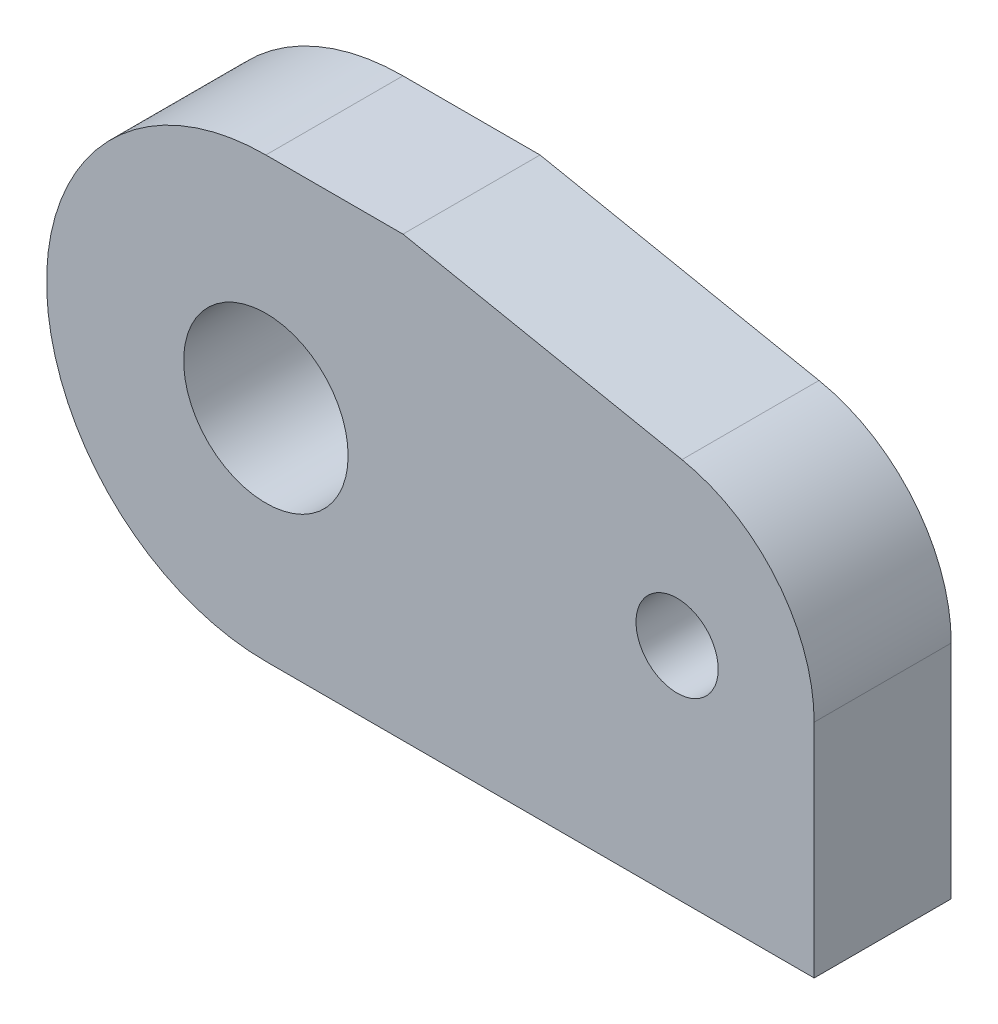
ISO-10303-21;
HEADER;
FILE_DESCRIPTION(('STEP AP214'),'2;1');
FILE_NAME('part.step','',(''),(''),'','','');
FILE_SCHEMA(('AUTOMOTIVE_DESIGN { 1 0 10303 214 1 1 1 1 }'));
ENDSEC;
DATA;
#1=APPLICATION_CONTEXT('core data for automotive mechanical design processes');
#2=APPLICATION_PROTOCOL_DEFINITION('international standard','automotive_design',2000,#1);
#3=PRODUCT_CONTEXT('',#1,'mechanical');
#4=PRODUCT('Part','Part','',(#3));
#5=PRODUCT_RELATED_PRODUCT_CATEGORY('part','',(#4));
#6=PRODUCT_DEFINITION_FORMATION('','',#4);
#7=PRODUCT_DEFINITION_CONTEXT('part definition',#1,'design');
#8=PRODUCT_DEFINITION('design','',#6,#7);
#9=PRODUCT_DEFINITION_SHAPE('','',#8);
#10=(LENGTH_UNIT() NAMED_UNIT(*) SI_UNIT(.MILLI.,.METRE.));
#11=(NAMED_UNIT(*) PLANE_ANGLE_UNIT() SI_UNIT($,.RADIAN.));
#12=(NAMED_UNIT(*) SI_UNIT($,.STERADIAN.) SOLID_ANGLE_UNIT());
#13=UNCERTAINTY_MEASURE_WITH_UNIT(LENGTH_MEASURE(1.E-05),#10,'distance_accuracy_value','');
#14=(GEOMETRIC_REPRESENTATION_CONTEXT(3) GLOBAL_UNCERTAINTY_ASSIGNED_CONTEXT((#13)) GLOBAL_UNIT_ASSIGNED_CONTEXT((#10,
#11,#12)) REPRESENTATION_CONTEXT('',''));
#15=CARTESIAN_POINT('',(0.,0.,0.));
#16=DIRECTION('',(0.,0.,1.));
#17=DIRECTION('',(1.,0.,0.));
#18=AXIS2_PLACEMENT_3D('',#15,#16,#17);
#19=CARTESIAN_POINT('',(0.,0.,5.));
#20=DIRECTION('',(0.,0.,1.));
#21=DIRECTION('',(1.,0.,0.));
#22=AXIS2_PLACEMENT_3D('',#19,#20,#21);
#23=PLANE('',#22);
#24=CARTESIAN_POINT('',(0.,0.,5.));
#25=DIRECTION('',(0.,0.,1.));
#26=DIRECTION('',(1.,0.,0.));
#27=AXIS2_PLACEMENT_3D('',#24,#25,#26);
#28=CIRCLE('',#27,3.);
#29=CARTESIAN_POINT('',(3.,0.,5.));
#30=VERTEX_POINT('',#29);
#31=EDGE_CURVE('E132',#30,#30,#28,.T.);
#32=ORIENTED_EDGE('',*,*,#31,.F.);
#33=EDGE_LOOP('',(#32));
#34=FACE_BOUND('',#33,.T.);
#35=DIRECTION('',(0.,1.,0.));
#36=VECTOR('',#35,1.);
#37=CARTESIAN_POINT('',(20.,-8.,5.));
#38=LINE('',#37,#36);
#39=CARTESIAN_POINT('',(20.,-8.,5.));
#40=VERTEX_POINT('',#39);
#41=CARTESIAN_POINT('',(20.,0.0811765836886535,5.));
#42=VERTEX_POINT('',#41);
#43=EDGE_CURVE('E97',#40,#42,#38,.T.);
#44=ORIENTED_EDGE('',*,*,#43,.T.);
#45=CARTESIAN_POINT('',(14.,0.0811765836886565,5.));
#46=DIRECTION('',(0.,0.,1.));
#47=DIRECTION('',(1.,0.,0.));
#48=AXIS2_PLACEMENT_3D('',#45,#46,#47);
#49=CIRCLE('',#48,6.);
#50=CARTESIAN_POINT('',(15.1766968108291,5.96466063783418,5.));
#51=VERTEX_POINT('',#50);
#52=EDGE_CURVE('E11',#42,#51,#49,.T.);
#53=ORIENTED_EDGE('',*,*,#52,.T.);
#54=DIRECTION('',(-0.98058067569092,0.196116135138184,0.));
#55=VECTOR('',#54,1.);
#56=CARTESIAN_POINT('',(20.,5.,5.));
#57=LINE('',#56,#55);
#58=CARTESIAN_POINT('',(5.,8.,5.));
#59=VERTEX_POINT('',#58);
#60=EDGE_CURVE('E134',#51,#59,#57,.T.);
#61=ORIENTED_EDGE('',*,*,#60,.T.);
#62=DIRECTION('',(-1.,0.,0.));
#63=VECTOR('',#62,1.);
#64=CARTESIAN_POINT('',(0.,8.,5.));
#65=LINE('',#64,#63);
#66=CARTESIAN_POINT('',(0.,8.,5.));
#67=VERTEX_POINT('',#66);
#68=EDGE_CURVE('E103',#59,#67,#65,.T.);
#69=ORIENTED_EDGE('',*,*,#68,.T.);
#70=CARTESIAN_POINT('',(0.,0.,5.));
#71=DIRECTION('',(0.,0.,1.));
#72=DIRECTION('',(1.,0.,0.));
#73=AXIS2_PLACEMENT_3D('',#70,#71,#72);
#74=CIRCLE('',#73,8.);
#75=CARTESIAN_POINT('',(0.,-8.,5.));
#76=VERTEX_POINT('',#75);
#77=EDGE_CURVE('E98',#67,#76,#74,.T.);
#78=ORIENTED_EDGE('',*,*,#77,.T.);
#79=DIRECTION('',(1.,0.,0.));
#80=VECTOR('',#79,1.);
#81=CARTESIAN_POINT('',(0.,-8.,5.));
#82=LINE('',#81,#80);
#83=EDGE_CURVE('E88',#76,#40,#82,.T.);
#84=ORIENTED_EDGE('',*,*,#83,.T.);
#85=EDGE_LOOP('',(#44,#53,#61,#69,#78,#84));
#86=FACE_BOUND('',#85,.T.);
#87=CARTESIAN_POINT('',(15.,0.,5.));
#88=DIRECTION('',(0.,0.,1.));
#89=DIRECTION('',(1.,0.,0.));
#90=AXIS2_PLACEMENT_3D('',#87,#88,#89);
#91=CIRCLE('',#90,1.5);
#92=CARTESIAN_POINT('',(16.5,0.,5.));
#93=VERTEX_POINT('',#92);
#94=EDGE_CURVE('E140',#93,#93,#91,.T.);
#95=ORIENTED_EDGE('',*,*,#94,.F.);
#96=EDGE_LOOP('',(#95));
#97=FACE_BOUND('',#96,.T.);
#98=ADVANCED_FACE('F35',(#34,#86,#97),#23,.T.);
#99=CARTESIAN_POINT('',(0.,0.,0.));
#100=DIRECTION('',(0.,0.,1.));
#101=DIRECTION('',(1.,0.,0.));
#102=AXIS2_PLACEMENT_3D('',#99,#100,#101);
#103=PLANE('',#102);
#104=CARTESIAN_POINT('',(0.,0.,0.));
#105=DIRECTION('',(0.,0.,1.));
#106=DIRECTION('',(1.,0.,0.));
#107=AXIS2_PLACEMENT_3D('',#104,#105,#106);
#108=CIRCLE('',#107,3.);
#109=CARTESIAN_POINT('',(3.,0.,0.));
#110=VERTEX_POINT('',#109);
#111=EDGE_CURVE('E137',#110,#110,#108,.T.);
#112=ORIENTED_EDGE('',*,*,#111,.T.);
#113=EDGE_LOOP('',(#112));
#114=FACE_BOUND('',#113,.T.);
#115=DIRECTION('',(-0.98058067569092,0.196116135138184,0.));
#116=VECTOR('',#115,1.);
#117=CARTESIAN_POINT('',(20.,5.,0.));
#118=LINE('',#117,#116);
#119=CARTESIAN_POINT('',(15.1766968108291,5.96466063783418,0.));
#120=VERTEX_POINT('',#119);
#121=CARTESIAN_POINT('',(5.,8.,0.));
#122=VERTEX_POINT('',#121);
#123=EDGE_CURVE('E125',#120,#122,#118,.T.);
#124=ORIENTED_EDGE('',*,*,#123,.F.);
#125=CARTESIAN_POINT('',(14.,0.0811765836886565,0.));
#126=DIRECTION('',(0.,0.,1.));
#127=DIRECTION('',(1.,0.,0.));
#128=AXIS2_PLACEMENT_3D('',#125,#126,#127);
#129=CIRCLE('',#128,6.);
#130=CARTESIAN_POINT('',(20.,0.0811765836886535,0.));
#131=VERTEX_POINT('',#130);
#132=EDGE_CURVE('E57',#120,#131,#129,.F.);
#133=ORIENTED_EDGE('',*,*,#132,.T.);
#134=DIRECTION('',(0.,1.,0.));
#135=VECTOR('',#134,1.);
#136=CARTESIAN_POINT('',(20.,-8.,0.));
#137=LINE('',#136,#135);
#138=CARTESIAN_POINT('',(20.,-8.,0.));
#139=VERTEX_POINT('',#138);
#140=EDGE_CURVE('E127',#139,#131,#137,.T.);
#141=ORIENTED_EDGE('',*,*,#140,.F.);
#142=DIRECTION('',(1.,0.,0.));
#143=VECTOR('',#142,1.);
#144=CARTESIAN_POINT('',(0.,-8.,0.));
#145=LINE('',#144,#143);
#146=CARTESIAN_POINT('',(0.,-8.,0.));
#147=VERTEX_POINT('',#146);
#148=EDGE_CURVE('E129',#147,#139,#145,.T.);
#149=ORIENTED_EDGE('',*,*,#148,.F.);
#150=CARTESIAN_POINT('',(0.,0.,0.));
#151=DIRECTION('',(0.,0.,1.));
#152=DIRECTION('',(1.,0.,0.));
#153=AXIS2_PLACEMENT_3D('',#150,#151,#152);
#154=CIRCLE('',#153,8.);
#155=CARTESIAN_POINT('',(0.,8.,0.));
#156=VERTEX_POINT('',#155);
#157=EDGE_CURVE('E111',#156,#147,#154,.T.);
#158=ORIENTED_EDGE('',*,*,#157,.F.);
#159=DIRECTION('',(-1.,0.,0.));
#160=VECTOR('',#159,1.);
#161=CARTESIAN_POINT('',(0.,8.,0.));
#162=LINE('',#161,#160);
#163=EDGE_CURVE('E107',#122,#156,#162,.T.);
#164=ORIENTED_EDGE('',*,*,#163,.F.);
#165=EDGE_LOOP('',(#124,#133,#141,#149,#158,#164));
#166=FACE_BOUND('',#165,.T.);
#167=CARTESIAN_POINT('',(15.,0.,0.));
#168=DIRECTION('',(0.,0.,1.));
#169=DIRECTION('',(1.,0.,0.));
#170=AXIS2_PLACEMENT_3D('',#167,#168,#169);
#171=CIRCLE('',#170,1.5);
#172=CARTESIAN_POINT('',(16.5,0.,0.));
#173=VERTEX_POINT('',#172);
#174=EDGE_CURVE('E143',#173,#173,#171,.T.);
#175=ORIENTED_EDGE('',*,*,#174,.T.);
#176=EDGE_LOOP('',(#175));
#177=FACE_BOUND('',#176,.T.);
#178=ADVANCED_FACE('F152',(#114,#166,#177),#103,.F.);
#179=CARTESIAN_POINT('',(0.,0.,5.));
#180=DIRECTION('',(0.,0.,-1.));
#181=DIRECTION('',(-1.,0.,0.));
#182=AXIS2_PLACEMENT_3D('',#179,#180,#181);
#183=CYLINDRICAL_SURFACE('',#182,8.);
#184=ORIENTED_EDGE('',*,*,#157,.T.);
#185=DIRECTION('',(0.,0.,-1.));
#186=VECTOR('',#185,1.);
#187=CARTESIAN_POINT('',(0.,-8.,5.));
#188=LINE('',#187,#186);
#189=EDGE_CURVE('E92',#76,#147,#188,.T.);
#190=ORIENTED_EDGE('',*,*,#189,.F.);
#191=ORIENTED_EDGE('',*,*,#77,.F.);
#192=DIRECTION('',(0.,0.,-1.));
#193=VECTOR('',#192,1.);
#194=CARTESIAN_POINT('',(0.,8.,5.));
#195=LINE('',#194,#193);
#196=EDGE_CURVE('E122',#67,#156,#195,.T.);
#197=ORIENTED_EDGE('',*,*,#196,.T.);
#198=EDGE_LOOP('',(#184,#190,#191,#197));
#199=FACE_BOUND('',#198,.T.);
#200=ADVANCED_FACE('F109',(#199),#183,.T.);
#201=CARTESIAN_POINT('',(0.,-8.,5.));
#202=DIRECTION('',(0.,1.,0.));
#203=DIRECTION('',(0.,0.,1.));
#204=AXIS2_PLACEMENT_3D('',#201,#202,#203);
#205=PLANE('',#204);
#206=ORIENTED_EDGE('',*,*,#148,.T.);
#207=DIRECTION('',(0.,0.,-1.));
#208=VECTOR('',#207,1.);
#209=CARTESIAN_POINT('',(20.,-8.,5.));
#210=LINE('',#209,#208);
#211=EDGE_CURVE('E95',#40,#139,#210,.T.);
#212=ORIENTED_EDGE('',*,*,#211,.F.);
#213=ORIENTED_EDGE('',*,*,#83,.F.);
#214=ORIENTED_EDGE('',*,*,#189,.T.);
#215=EDGE_LOOP('',(#206,#212,#213,#214));
#216=FACE_BOUND('',#215,.T.);
#217=ADVANCED_FACE('F90',(#216),#205,.F.);
#218=CARTESIAN_POINT('',(20.,-8.,5.));
#219=DIRECTION('',(-1.,0.,0.));
#220=DIRECTION('',(0.,0.,1.));
#221=AXIS2_PLACEMENT_3D('',#218,#219,#220);
#222=PLANE('',#221);
#223=ORIENTED_EDGE('',*,*,#140,.T.);
#224=DIRECTION('',(0.,0.,-1.));
#225=VECTOR('',#224,1.);
#226=CARTESIAN_POINT('',(20.,0.0811765836886569,5.));
#227=LINE('',#226,#225);
#228=EDGE_CURVE('E43',#131,#42,#227,.F.);
#229=ORIENTED_EDGE('',*,*,#228,.T.);
#230=ORIENTED_EDGE('',*,*,#43,.F.);
#231=ORIENTED_EDGE('',*,*,#211,.T.);
#232=EDGE_LOOP('',(#223,#229,#230,#231));
#233=FACE_BOUND('',#232,.T.);
#234=ADVANCED_FACE('F172',(#233),#222,.F.);
#235=CARTESIAN_POINT('',(20.,5.,5.));
#236=DIRECTION('',(-0.196116135138184,-0.98058067569092,0.));
#237=DIRECTION('',(0.98058067569092,-0.196116135138184,0.));
#238=AXIS2_PLACEMENT_3D('',#235,#236,#237);
#239=PLANE('',#238);
#240=ORIENTED_EDGE('',*,*,#60,.F.);
#241=DIRECTION('',(0.,0.,-1.));
#242=VECTOR('',#241,1.);
#243=CARTESIAN_POINT('',(15.1766968108291,5.96466063783418,5.));
#244=LINE('',#243,#242);
#245=EDGE_CURVE('E112',#51,#120,#244,.T.);
#246=ORIENTED_EDGE('',*,*,#245,.T.);
#247=ORIENTED_EDGE('',*,*,#123,.T.);
#248=DIRECTION('',(0.,0.,-1.));
#249=VECTOR('',#248,1.);
#250=CARTESIAN_POINT('',(5.,8.,5.));
#251=LINE('',#250,#249);
#252=EDGE_CURVE('E116',#59,#122,#251,.T.);
#253=ORIENTED_EDGE('',*,*,#252,.F.);
#254=EDGE_LOOP('',(#240,#246,#247,#253));
#255=FACE_BOUND('',#254,.T.);
#256=ADVANCED_FACE('F168',(#255),#239,.F.);
#257=CARTESIAN_POINT('',(0.,8.,5.));
#258=DIRECTION('',(0.,-1.,0.));
#259=DIRECTION('',(0.,0.,-1.));
#260=AXIS2_PLACEMENT_3D('',#257,#258,#259);
#261=PLANE('',#260);
#262=ORIENTED_EDGE('',*,*,#163,.T.);
#263=ORIENTED_EDGE('',*,*,#196,.F.);
#264=ORIENTED_EDGE('',*,*,#68,.F.);
#265=ORIENTED_EDGE('',*,*,#252,.T.);
#266=EDGE_LOOP('',(#262,#263,#264,#265));
#267=FACE_BOUND('',#266,.T.);
#268=ADVANCED_FACE('F165',(#267),#261,.F.);
#269=CARTESIAN_POINT('',(0.,0.,5.));
#270=DIRECTION('',(0.,0.,-1.));
#271=DIRECTION('',(-1.,0.,0.));
#272=AXIS2_PLACEMENT_3D('',#269,#270,#271);
#273=CYLINDRICAL_SURFACE('',#272,3.);
#274=ORIENTED_EDGE('',*,*,#31,.T.);
#275=EDGE_LOOP('',(#274));
#276=FACE_BOUND('',#275,.T.);
#277=ORIENTED_EDGE('',*,*,#111,.F.);
#278=EDGE_LOOP('',(#277));
#279=FACE_BOUND('',#278,.T.);
#280=ADVANCED_FACE('F162',(#276,#279),#273,.F.);
#281=CARTESIAN_POINT('',(15.,0.,5.));
#282=DIRECTION('',(0.,0.,-1.));
#283=DIRECTION('',(-1.,0.,0.));
#284=AXIS2_PLACEMENT_3D('',#281,#282,#283);
#285=CYLINDRICAL_SURFACE('',#284,1.5);
#286=ORIENTED_EDGE('',*,*,#94,.T.);
#287=EDGE_LOOP('',(#286));
#288=FACE_BOUND('',#287,.T.);
#289=ORIENTED_EDGE('',*,*,#174,.F.);
#290=EDGE_LOOP('',(#289));
#291=FACE_BOUND('',#290,.T.);
#292=ADVANCED_FACE('F149',(#288,#291),#285,.F.);
#293=CARTESIAN_POINT('',(14.,0.0811765836886565,5.));
#294=DIRECTION('',(0.,0.,-1.));
#295=DIRECTION('',(-1.,0.,0.));
#296=AXIS2_PLACEMENT_3D('',#293,#294,#295);
#297=CYLINDRICAL_SURFACE('',#296,6.);
#298=ORIENTED_EDGE('',*,*,#52,.F.);
#299=ORIENTED_EDGE('',*,*,#228,.F.);
#300=ORIENTED_EDGE('',*,*,#132,.F.);
#301=ORIENTED_EDGE('',*,*,#245,.F.);
#302=EDGE_LOOP('',(#298,#299,#300,#301));
#303=FACE_BOUND('',#302,.T.);
#304=ADVANCED_FACE('F37',(#303),#297,.T.);
#305=CLOSED_SHELL('',(#98,#178,#200,#217,#234,#256,#268,#280,#292,#304));
#306=MANIFOLD_SOLID_BREP('B2',#305);
#307=ADVANCED_BREP_SHAPE_REPRESENTATION('',(#18,#306),#14);
#308=SHAPE_DEFINITION_REPRESENTATION(#9,#307);
ENDSEC;
END-ISO-10303-21;
